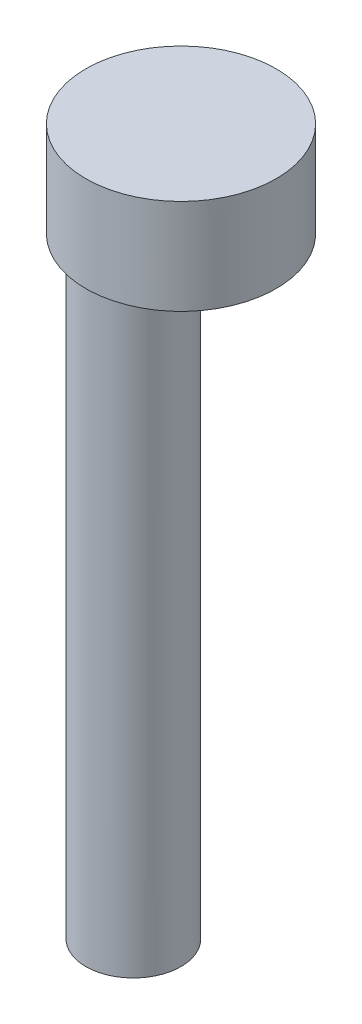
ISO-10303-21;
HEADER;
FILE_DESCRIPTION(('STEP AP214'),'2;1');
FILE_NAME('part.step','',(''),(''),'','','');
FILE_SCHEMA(('AUTOMOTIVE_DESIGN { 1 0 10303 214 1 1 1 1 }'));
ENDSEC;
DATA;
#1=APPLICATION_CONTEXT('core data for automotive mechanical design processes');
#2=APPLICATION_PROTOCOL_DEFINITION('international standard','automotive_design',2000,#1);
#3=PRODUCT_CONTEXT('',#1,'mechanical');
#4=PRODUCT('Part','Part','',(#3));
#5=PRODUCT_RELATED_PRODUCT_CATEGORY('part','',(#4));
#6=PRODUCT_DEFINITION_FORMATION('','',#4);
#7=PRODUCT_DEFINITION_CONTEXT('part definition',#1,'design');
#8=PRODUCT_DEFINITION('design','',#6,#7);
#9=PRODUCT_DEFINITION_SHAPE('','',#8);
#10=(LENGTH_UNIT() NAMED_UNIT(*) SI_UNIT(.MILLI.,.METRE.));
#11=(NAMED_UNIT(*) PLANE_ANGLE_UNIT() SI_UNIT($,.RADIAN.));
#12=(NAMED_UNIT(*) SI_UNIT($,.STERADIAN.) SOLID_ANGLE_UNIT());
#13=UNCERTAINTY_MEASURE_WITH_UNIT(LENGTH_MEASURE(1.E-05),#10,'distance_accuracy_value','');
#14=(GEOMETRIC_REPRESENTATION_CONTEXT(3) GLOBAL_UNCERTAINTY_ASSIGNED_CONTEXT((#13)) GLOBAL_UNIT_ASSIGNED_CONTEXT((#10,
#11,#12)) REPRESENTATION_CONTEXT('',''));
#15=CARTESIAN_POINT('',(0.,0.,0.));
#16=DIRECTION('',(0.,0.,1.));
#17=DIRECTION('',(1.,0.,0.));
#18=AXIS2_PLACEMENT_3D('',#15,#16,#17);
#19=CARTESIAN_POINT('',(0.,10.,0.));
#20=DIRECTION('',(0.,-1.,0.));
#21=DIRECTION('',(0.,0.,-1.));
#22=AXIS2_PLACEMENT_3D('',#19,#20,#21);
#23=CYLINDRICAL_SURFACE('',#22,0.75);
#24=CARTESIAN_POINT('',(0.,10.,0.));
#25=DIRECTION('',(0.,1.,0.));
#26=DIRECTION('',(0.,0.,1.));
#27=AXIS2_PLACEMENT_3D('',#24,#25,#26);
#28=CIRCLE('',#27,0.75);
#29=CARTESIAN_POINT('',(-0.75,10.,0.));
#30=VERTEX_POINT('',#29);
#31=EDGE_CURVE('E11',#30,#30,#28,.T.);
#32=ORIENTED_EDGE('',*,*,#31,.F.);
#33=EDGE_LOOP('',(#32));
#34=FACE_BOUND('',#33,.T.);
#35=CARTESIAN_POINT('',(0.,0.,0.));
#36=DIRECTION('',(0.,1.,0.));
#37=DIRECTION('',(0.,0.,1.));
#38=AXIS2_PLACEMENT_3D('',#35,#36,#37);
#39=CIRCLE('',#38,0.75);
#40=CARTESIAN_POINT('',(0.,0.,0.75));
#41=VERTEX_POINT('',#40);
#42=EDGE_CURVE('E38',#41,#41,#39,.T.);
#43=ORIENTED_EDGE('',*,*,#42,.T.);
#44=EDGE_LOOP('',(#43));
#45=FACE_BOUND('',#44,.T.);
#46=ADVANCED_FACE('F35',(#34,#45),#23,.T.);
#47=CARTESIAN_POINT('',(0.,0.,0.));
#48=DIRECTION('',(0.,1.,0.));
#49=DIRECTION('',(0.,0.,1.));
#50=AXIS2_PLACEMENT_3D('',#47,#48,#49);
#51=PLANE('',#50);
#52=ORIENTED_EDGE('',*,*,#42,.F.);
#53=EDGE_LOOP('',(#52));
#54=FACE_BOUND('',#53,.T.);
#55=ADVANCED_FACE('F61',(#54),#51,.F.);
#56=CARTESIAN_POINT('',(0.75,11.5,0.));
#57=DIRECTION('',(0.,-1.,0.));
#58=DIRECTION('',(0.,0.,-1.));
#59=AXIS2_PLACEMENT_3D('',#56,#57,#58);
#60=CYLINDRICAL_SURFACE('',#59,1.5);
#61=CARTESIAN_POINT('',(0.75,11.5,0.));
#62=DIRECTION('',(0.,1.,0.));
#63=DIRECTION('',(0.,0.,1.));
#64=AXIS2_PLACEMENT_3D('',#61,#62,#63);
#65=CIRCLE('',#64,1.5);
#66=CARTESIAN_POINT('',(0.75,11.5,1.5));
#67=VERTEX_POINT('',#66);
#68=EDGE_CURVE('E52',#67,#67,#65,.T.);
#69=ORIENTED_EDGE('',*,*,#68,.F.);
#70=EDGE_LOOP('',(#69));
#71=FACE_BOUND('',#70,.T.);
#72=CARTESIAN_POINT('',(0.75,10.,0.));
#73=DIRECTION('',(0.,1.,0.));
#74=DIRECTION('',(0.,0.,1.));
#75=AXIS2_PLACEMENT_3D('',#72,#73,#74);
#76=CIRCLE('',#75,1.5);
#77=EDGE_CURVE('E49',#30,#30,#76,.T.);
#78=ORIENTED_EDGE('',*,*,#77,.T.);
#79=EDGE_LOOP('',(#78));
#80=FACE_BOUND('',#79,.T.);
#81=ADVANCED_FACE('F51',(#71,#80),#60,.T.);
#82=CARTESIAN_POINT('',(0.75,11.5,0.));
#83=DIRECTION('',(0.,1.,0.));
#84=DIRECTION('',(0.,0.,1.));
#85=AXIS2_PLACEMENT_3D('',#82,#83,#84);
#86=PLANE('',#85);
#87=ORIENTED_EDGE('',*,*,#68,.T.);
#88=EDGE_LOOP('',(#87));
#89=FACE_BOUND('',#88,.T.);
#90=ADVANCED_FACE('F67',(#89),#86,.T.);
#91=CARTESIAN_POINT('',(0.75,10.,0.));
#92=DIRECTION('',(0.,1.,0.));
#93=DIRECTION('',(0.,0.,1.));
#94=AXIS2_PLACEMENT_3D('',#91,#92,#93);
#95=PLANE('',#94);
#96=ORIENTED_EDGE('',*,*,#77,.F.);
#97=ORIENTED_EDGE('',*,*,#31,.T.);
#98=EDGE_LOOP('',(#96,#97));
#99=FACE_BOUND('',#98,.T.);
#100=ADVANCED_FACE('F48',(#99),#95,.F.);
#101=CLOSED_SHELL('',(#46,#55,#81,#90,#100));
#102=MANIFOLD_SOLID_BREP('B2',#101);
#103=ADVANCED_BREP_SHAPE_REPRESENTATION('',(#18,#102),#14);
#104=SHAPE_DEFINITION_REPRESENTATION(#9,#103);
ENDSEC;
END-ISO-10303-21;
